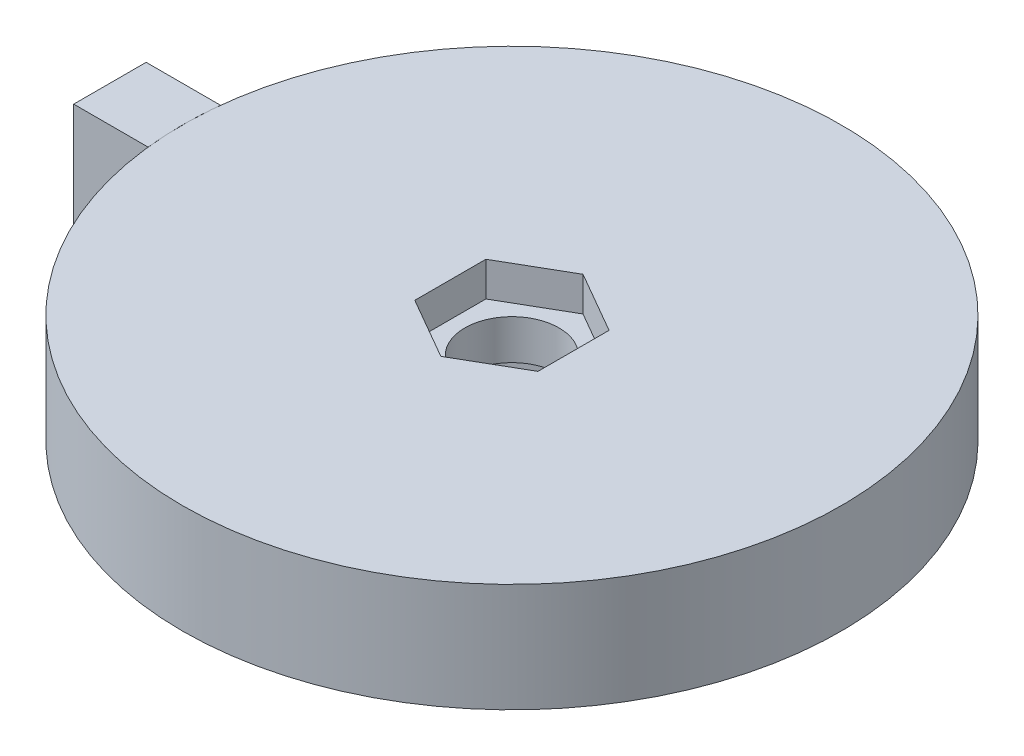
ISO-10303-21;
HEADER;
FILE_DESCRIPTION(('STEP AP214'),'2;1');
FILE_NAME('part.step','',(''),(''),'','','');
FILE_SCHEMA(('AUTOMOTIVE_DESIGN { 1 0 10303 214 1 1 1 1 }'));
ENDSEC;
DATA;
#1=APPLICATION_CONTEXT('core data for automotive mechanical design processes');
#2=APPLICATION_PROTOCOL_DEFINITION('international standard','automotive_design',2000,#1);
#3=PRODUCT_CONTEXT('',#1,'mechanical');
#4=PRODUCT('Part','Part','',(#3));
#5=PRODUCT_RELATED_PRODUCT_CATEGORY('part','',(#4));
#6=PRODUCT_DEFINITION_FORMATION('','',#4);
#7=PRODUCT_DEFINITION_CONTEXT('part definition',#1,'design');
#8=PRODUCT_DEFINITION('design','',#6,#7);
#9=PRODUCT_DEFINITION_SHAPE('','',#8);
#10=(LENGTH_UNIT() NAMED_UNIT(*) SI_UNIT(.MILLI.,.METRE.));
#11=(NAMED_UNIT(*) PLANE_ANGLE_UNIT() SI_UNIT($,.RADIAN.));
#12=(NAMED_UNIT(*) SI_UNIT($,.STERADIAN.) SOLID_ANGLE_UNIT());
#13=UNCERTAINTY_MEASURE_WITH_UNIT(LENGTH_MEASURE(1.E-05),#10,'distance_accuracy_value','');
#14=(GEOMETRIC_REPRESENTATION_CONTEXT(3) GLOBAL_UNCERTAINTY_ASSIGNED_CONTEXT((#13)) GLOBAL_UNIT_ASSIGNED_CONTEXT((#10,
#11,#12)) REPRESENTATION_CONTEXT('',''));
#15=CARTESIAN_POINT('',(0.,0.,0.));
#16=DIRECTION('',(0.,0.,1.));
#17=DIRECTION('',(1.,0.,0.));
#18=AXIS2_PLACEMENT_3D('',#15,#16,#17);
#19=CARTESIAN_POINT('',(-55.5,15.,0.));
#20=DIRECTION('',(-1.,0.,0.));
#21=DIRECTION('',(0.,0.,1.));
#22=AXIS2_PLACEMENT_3D('',#19,#20,#21);
#23=PLANE('',#22);
#24=DIRECTION('',(0.,0.,-1.));
#25=VECTOR('',#24,1.);
#26=CARTESIAN_POINT('',(-55.5,0.,0.));
#27=LINE('',#26,#25);
#28=CARTESIAN_POINT('',(-55.5,0.,5.));
#29=VERTEX_POINT('',#28);
#30=CARTESIAN_POINT('',(-55.5,0.,-5.));
#31=VERTEX_POINT('',#30);
#32=EDGE_CURVE('E112',#29,#31,#27,.T.);
#33=ORIENTED_EDGE('',*,*,#32,.F.);
#34=DIRECTION('',(0.,-1.,0.));
#35=VECTOR('',#34,1.);
#36=CARTESIAN_POINT('',(-55.5,15.,5.));
#37=LINE('',#36,#35);
#38=CARTESIAN_POINT('',(-55.5,15.,5.));
#39=VERTEX_POINT('',#38);
#40=EDGE_CURVE('E12',#39,#29,#37,.T.);
#41=ORIENTED_EDGE('',*,*,#40,.F.);
#42=DIRECTION('',(0.,0.,-1.));
#43=VECTOR('',#42,1.);
#44=CARTESIAN_POINT('',(-55.5,15.,0.));
#45=LINE('',#44,#43);
#46=CARTESIAN_POINT('',(-55.5,15.,-5.));
#47=VERTEX_POINT('',#46);
#48=EDGE_CURVE('E107',#39,#47,#45,.T.);
#49=ORIENTED_EDGE('',*,*,#48,.T.);
#50=DIRECTION('',(0.,-1.,0.));
#51=VECTOR('',#50,1.);
#52=CARTESIAN_POINT('',(-55.5,15.,-5.));
#53=LINE('',#52,#51);
#54=EDGE_CURVE('E50',#47,#31,#53,.T.);
#55=ORIENTED_EDGE('',*,*,#54,.T.);
#56=EDGE_LOOP('',(#33,#41,#49,#55));
#57=FACE_BOUND('',#56,.T.);
#58=ADVANCED_FACE('F47',(#57),#23,.T.);
#59=CARTESIAN_POINT('',(0.,15.,5.00000000000001));
#60=DIRECTION('',(0.,0.,-1.));
#61=DIRECTION('',(-1.,0.,0.));
#62=AXIS2_PLACEMENT_3D('',#59,#60,#61);
#63=PLANE('',#62);
#64=DIRECTION('',(1.,0.,0.));
#65=VECTOR('',#64,1.);
#66=CARTESIAN_POINT('',(0.,0.,5.00000000000001));
#67=LINE('',#66,#65);
#68=CARTESIAN_POINT('',(-45.224440295044,0.,5.));
#69=VERTEX_POINT('',#68);
#70=EDGE_CURVE('E80',#29,#69,#67,.T.);
#71=ORIENTED_EDGE('',*,*,#70,.T.);
#72=DIRECTION('',(0.,-1.,0.));
#73=VECTOR('',#72,1.);
#74=CARTESIAN_POINT('',(-45.224440295044,15.,5.));
#75=LINE('',#74,#73);
#76=CARTESIAN_POINT('',(-45.224440295044,15.,5.));
#77=VERTEX_POINT('',#76);
#78=EDGE_CURVE('E56',#77,#69,#75,.T.);
#79=ORIENTED_EDGE('',*,*,#78,.F.);
#80=DIRECTION('',(1.,0.,0.));
#81=VECTOR('',#80,1.);
#82=CARTESIAN_POINT('',(0.,15.,5.00000000000001));
#83=LINE('',#82,#81);
#84=EDGE_CURVE('E97',#39,#77,#83,.T.);
#85=ORIENTED_EDGE('',*,*,#84,.F.);
#86=ORIENTED_EDGE('',*,*,#40,.T.);
#87=EDGE_LOOP('',(#71,#79,#85,#86));
#88=FACE_BOUND('',#87,.T.);
#89=ADVANCED_FACE('F122',(#88),#63,.F.);
#90=CARTESIAN_POINT('',(0.,15.,0.));
#91=DIRECTION('',(0.,-1.,0.));
#92=DIRECTION('',(0.,0.,-1.));
#93=AXIS2_PLACEMENT_3D('',#90,#91,#92);
#94=CYLINDRICAL_SURFACE('',#93,45.5);
#95=CARTESIAN_POINT('',(0.,0.,0.));
#96=DIRECTION('',(0.,-1.,0.));
#97=DIRECTION('',(0.,0.,-1.));
#98=AXIS2_PLACEMENT_3D('',#95,#96,#97);
#99=CIRCLE('',#98,45.5);
#100=CARTESIAN_POINT('',(-45.224440295044,0.,-5.));
#101=VERTEX_POINT('',#100);
#102=EDGE_CURVE('E104',#69,#101,#99,.T.);
#103=ORIENTED_EDGE('',*,*,#102,.T.);
#104=DIRECTION('',(0.,-1.,0.));
#105=VECTOR('',#104,1.);
#106=CARTESIAN_POINT('',(-45.224440295044,15.,-5.));
#107=LINE('',#106,#105);
#108=CARTESIAN_POINT('',(-45.224440295044,15.,-5.));
#109=VERTEX_POINT('',#108);
#110=EDGE_CURVE('E101',#109,#101,#107,.T.);
#111=ORIENTED_EDGE('',*,*,#110,.F.);
#112=CARTESIAN_POINT('',(0.,15.,0.));
#113=DIRECTION('',(0.,-1.,0.));
#114=DIRECTION('',(0.,0.,-1.));
#115=AXIS2_PLACEMENT_3D('',#112,#113,#114);
#116=CIRCLE('',#115,45.5);
#117=EDGE_CURVE('E92',#77,#109,#116,.T.);
#118=ORIENTED_EDGE('',*,*,#117,.F.);
#119=ORIENTED_EDGE('',*,*,#78,.T.);
#120=EDGE_LOOP('',(#103,#111,#118,#119));
#121=FACE_BOUND('',#120,.T.);
#122=ADVANCED_FACE('F102',(#121),#94,.F.);
#123=CARTESIAN_POINT('',(0.,15.,-5.00000000000001));
#124=DIRECTION('',(0.,0.,-1.));
#125=DIRECTION('',(-1.,0.,0.));
#126=AXIS2_PLACEMENT_3D('',#123,#124,#125);
#127=PLANE('',#126);
#128=DIRECTION('',(1.,0.,0.));
#129=VECTOR('',#128,1.);
#130=CARTESIAN_POINT('',(0.,0.,-5.00000000000001));
#131=LINE('',#130,#129);
#132=EDGE_CURVE('E115',#31,#101,#131,.T.);
#133=ORIENTED_EDGE('',*,*,#132,.F.);
#134=ORIENTED_EDGE('',*,*,#54,.F.);
#135=DIRECTION('',(1.,0.,0.));
#136=VECTOR('',#135,1.);
#137=CARTESIAN_POINT('',(0.,15.,-5.00000000000001));
#138=LINE('',#137,#136);
#139=EDGE_CURVE('E96',#47,#109,#138,.T.);
#140=ORIENTED_EDGE('',*,*,#139,.T.);
#141=ORIENTED_EDGE('',*,*,#110,.T.);
#142=EDGE_LOOP('',(#133,#134,#140,#141));
#143=FACE_BOUND('',#142,.T.);
#144=ADVANCED_FACE('F106',(#143),#127,.T.);
#145=CARTESIAN_POINT('',(0.,15.,0.));
#146=DIRECTION('',(0.,-1.,0.));
#147=DIRECTION('',(0.,0.,-1.));
#148=AXIS2_PLACEMENT_3D('',#145,#146,#147);
#149=PLANE('',#148);
#150=ORIENTED_EDGE('',*,*,#48,.F.);
#151=ORIENTED_EDGE('',*,*,#84,.T.);
#152=ORIENTED_EDGE('',*,*,#117,.T.);
#153=ORIENTED_EDGE('',*,*,#139,.F.);
#154=EDGE_LOOP('',(#150,#151,#152,#153));
#155=FACE_BOUND('',#154,.T.);
#156=ADVANCED_FACE('F95',(#155),#149,.F.);
#157=CARTESIAN_POINT('',(0.,0.,0.));
#158=DIRECTION('',(0.,-1.,0.));
#159=DIRECTION('',(0.,0.,-1.));
#160=AXIS2_PLACEMENT_3D('',#157,#158,#159);
#161=PLANE('',#160);
#162=ORIENTED_EDGE('',*,*,#32,.T.);
#163=ORIENTED_EDGE('',*,*,#132,.T.);
#164=ORIENTED_EDGE('',*,*,#102,.F.);
#165=ORIENTED_EDGE('',*,*,#70,.F.);
#166=EDGE_LOOP('',(#162,#163,#164,#165));
#167=FACE_BOUND('',#166,.T.);
#168=ADVANCED_FACE('F120',(#167),#161,.T.);
#169=CLOSED_SHELL('',(#58,#89,#122,#144,#156,#168));
#170=MANIFOLD_SOLID_BREP('B2',#169);
#171=CARTESIAN_POINT('',(0.,0.,0.));
#172=DIRECTION('',(0.,1.,0.));
#173=DIRECTION('',(0.,0.,1.));
#174=AXIS2_PLACEMENT_3D('',#171,#172,#173);
#175=PLANE('',#174);
#176=CARTESIAN_POINT('',(0.,0.,0.));
#177=DIRECTION('',(0.,1.,0.));
#178=DIRECTION('',(0.,0.,1.));
#179=AXIS2_PLACEMENT_3D('',#176,#177,#178);
#180=CIRCLE('',#179,45.5);
#181=CARTESIAN_POINT('',(0.,0.,45.5));
#182=VERTEX_POINT('',#181);
#183=EDGE_CURVE('E189',#182,#182,#180,.T.);
#184=ORIENTED_EDGE('',*,*,#183,.F.);
#185=EDGE_LOOP('',(#184));
#186=FACE_BOUND('',#185,.T.);
#187=DIRECTION('',(-0.866025403784439,0.,0.5));
#188=VECTOR('',#187,1.);
#189=CARTESIAN_POINT('',(0.,0.,-9.81495457622362));
#190=LINE('',#189,#188);
#191=CARTESIAN_POINT('',(0.,0.,-9.81495457622362));
#192=VERTEX_POINT('',#191);
#193=CARTESIAN_POINT('',(-8.5,0.,-4.90747728811182));
#194=VERTEX_POINT('',#193);
#195=EDGE_CURVE('E197',#192,#194,#190,.T.);
#196=ORIENTED_EDGE('',*,*,#195,.T.);
#197=DIRECTION('',(0.,0.,1.));
#198=VECTOR('',#197,1.);
#199=CARTESIAN_POINT('',(-8.5,0.,-4.90747728811182));
#200=LINE('',#199,#198);
#201=CARTESIAN_POINT('',(-8.5,0.,4.90747728811182));
#202=VERTEX_POINT('',#201);
#203=EDGE_CURVE('E293',#194,#202,#200,.T.);
#204=ORIENTED_EDGE('',*,*,#203,.T.);
#205=DIRECTION('',(0.866025403784438,0.,0.5));
#206=VECTOR('',#205,1.);
#207=CARTESIAN_POINT('',(-8.5,0.,4.90747728811182));
#208=LINE('',#207,#206);
#209=CARTESIAN_POINT('',(0.,0.,9.81495457622364));
#210=VERTEX_POINT('',#209);
#211=EDGE_CURVE('E384',#202,#210,#208,.T.);
#212=ORIENTED_EDGE('',*,*,#211,.T.);
#213=DIRECTION('',(0.866025403784438,0.,-0.5));
#214=VECTOR('',#213,1.);
#215=CARTESIAN_POINT('',(0.,0.,9.81495457622364));
#216=LINE('',#215,#214);
#217=CARTESIAN_POINT('',(8.5,0.,4.90747728811182));
#218=VERTEX_POINT('',#217);
#219=EDGE_CURVE('E391',#210,#218,#216,.T.);
#220=ORIENTED_EDGE('',*,*,#219,.T.);
#221=DIRECTION('',(0.,0.,-1.));
#222=VECTOR('',#221,1.);
#223=CARTESIAN_POINT('',(8.5,0.,4.90747728811182));
#224=LINE('',#223,#222);
#225=CARTESIAN_POINT('',(8.5,0.,-4.90747728811179));
#226=VERTEX_POINT('',#225);
#227=EDGE_CURVE('E394',#218,#226,#224,.T.);
#228=ORIENTED_EDGE('',*,*,#227,.T.);
#229=DIRECTION('',(-0.866025403784439,0.,-0.5));
#230=VECTOR('',#229,1.);
#231=CARTESIAN_POINT('',(8.5,0.,-4.90747728811179));
#232=LINE('',#231,#230);
#233=EDGE_CURVE('E289',#226,#192,#232,.T.);
#234=ORIENTED_EDGE('',*,*,#233,.T.);
#235=EDGE_LOOP('',(#196,#204,#212,#220,#228,#234));
#236=FACE_BOUND('',#235,.T.);
#237=ADVANCED_FACE('F180',(#186,#236),#175,.F.);
#238=CARTESIAN_POINT('',(0.,0.,0.));
#239=DIRECTION('',(0.,1.,0.));
#240=DIRECTION('',(0.,0.,1.));
#241=AXIS2_PLACEMENT_3D('',#238,#239,#240);
#242=CYLINDRICAL_SURFACE('',#241,6.5);
#243=CARTESIAN_POINT('',(0.,4.75,0.));
#244=DIRECTION('',(0.,1.,0.));
#245=DIRECTION('',(0.,0.,1.));
#246=AXIS2_PLACEMENT_3D('',#243,#244,#245);
#247=CIRCLE('',#246,6.5);
#248=CARTESIAN_POINT('',(0.,4.75,6.5));
#249=VERTEX_POINT('',#248);
#250=EDGE_CURVE('E184',#249,#249,#247,.F.);
#251=ORIENTED_EDGE('',*,*,#250,.T.);
#252=EDGE_LOOP('',(#251));
#253=FACE_BOUND('',#252,.T.);
#254=CARTESIAN_POINT('',(0.,10.25,0.));
#255=DIRECTION('',(0.,1.,0.));
#256=DIRECTION('',(0.,0.,1.));
#257=AXIS2_PLACEMENT_3D('',#254,#255,#256);
#258=CIRCLE('',#257,6.5);
#259=CARTESIAN_POINT('',(0.,10.25,6.5));
#260=VERTEX_POINT('',#259);
#261=EDGE_CURVE('E332',#260,#260,#258,.F.);
#262=ORIENTED_EDGE('',*,*,#261,.F.);
#263=EDGE_LOOP('',(#262));
#264=FACE_BOUND('',#263,.T.);
#265=ADVANCED_FACE('F348',(#253,#264),#242,.F.);
#266=CARTESIAN_POINT('',(0.,15.,0.));
#267=DIRECTION('',(0.,-1.,0.));
#268=DIRECTION('',(0.,0.,-1.));
#269=AXIS2_PLACEMENT_3D('',#266,#267,#268);
#270=CYLINDRICAL_SURFACE('',#269,45.5);
#271=CARTESIAN_POINT('',(0.,15.,0.));
#272=DIRECTION('',(0.,1.,0.));
#273=DIRECTION('',(0.,0.,1.));
#274=AXIS2_PLACEMENT_3D('',#271,#272,#273);
#275=CIRCLE('',#274,45.5);
#276=CARTESIAN_POINT('',(0.,15.,45.5));
#277=VERTEX_POINT('',#276);
#278=EDGE_CURVE('E45',#277,#277,#275,.T.);
#279=ORIENTED_EDGE('',*,*,#278,.F.);
#280=EDGE_LOOP('',(#279));
#281=FACE_BOUND('',#280,.T.);
#282=ORIENTED_EDGE('',*,*,#183,.T.);
#283=EDGE_LOOP('',(#282));
#284=FACE_BOUND('',#283,.T.);
#285=ADVANCED_FACE('F182',(#281,#284),#270,.T.);
#286=CARTESIAN_POINT('',(0.,15.,0.));
#287=DIRECTION('',(0.,1.,0.));
#288=DIRECTION('',(0.,0.,1.));
#289=AXIS2_PLACEMENT_3D('',#286,#287,#288);
#290=PLANE('',#289);
#291=DIRECTION('',(0.,0.,-1.));
#292=VECTOR('',#291,1.);
#293=CARTESIAN_POINT('',(8.5,15.,4.90747728811182));
#294=LINE('',#293,#292);
#295=CARTESIAN_POINT('',(8.5,15.,4.90747728811182));
#296=VERTEX_POINT('',#295);
#297=CARTESIAN_POINT('',(8.5,15.,-4.90747728811179));
#298=VERTEX_POINT('',#297);
#299=EDGE_CURVE('E306',#296,#298,#294,.T.);
#300=ORIENTED_EDGE('',*,*,#299,.F.);
#301=DIRECTION('',(0.866025403784438,0.,-0.500000000000001));
#302=VECTOR('',#301,1.);
#303=CARTESIAN_POINT('',(4.25000000000001,15.,7.36121593216773));
#304=LINE('',#303,#302);
#305=CARTESIAN_POINT('',(0.,15.,9.81495457622364));
#306=VERTEX_POINT('',#305);
#307=EDGE_CURVE('E326',#306,#296,#304,.T.);
#308=ORIENTED_EDGE('',*,*,#307,.F.);
#309=DIRECTION('',(0.866025403784439,0.,0.5));
#310=VECTOR('',#309,1.);
#311=CARTESIAN_POINT('',(-4.25,15.,7.36121593216773));
#312=LINE('',#311,#310);
#313=CARTESIAN_POINT('',(-8.5,15.,4.90747728811182));
#314=VERTEX_POINT('',#313);
#315=EDGE_CURVE('E323',#314,#306,#312,.T.);
#316=ORIENTED_EDGE('',*,*,#315,.F.);
#317=DIRECTION('',(0.,0.,1.));
#318=VECTOR('',#317,1.);
#319=CARTESIAN_POINT('',(-8.5,15.,0.));
#320=LINE('',#319,#318);
#321=CARTESIAN_POINT('',(-8.5,15.,-4.90747728811182));
#322=VERTEX_POINT('',#321);
#323=EDGE_CURVE('E320',#322,#314,#320,.T.);
#324=ORIENTED_EDGE('',*,*,#323,.F.);
#325=DIRECTION('',(-0.866025403784439,0.,0.499999999999999));
#326=VECTOR('',#325,1.);
#327=CARTESIAN_POINT('',(-4.25,15.,-7.36121593216772));
#328=LINE('',#327,#326);
#329=CARTESIAN_POINT('',(0.,15.,-9.81495457622362));
#330=VERTEX_POINT('',#329);
#331=EDGE_CURVE('E317',#330,#322,#328,.T.);
#332=ORIENTED_EDGE('',*,*,#331,.F.);
#333=DIRECTION('',(-0.866025403784439,0.,-0.5));
#334=VECTOR('',#333,1.);
#335=CARTESIAN_POINT('',(4.25000000000002,15.,-7.36121593216769));
#336=LINE('',#335,#334);
#337=EDGE_CURVE('E297',#298,#330,#336,.T.);
#338=ORIENTED_EDGE('',*,*,#337,.F.);
#339=EDGE_LOOP('',(#300,#308,#316,#324,#332,#338));
#340=FACE_BOUND('',#339,.T.);
#341=ORIENTED_EDGE('',*,*,#278,.T.);
#342=EDGE_LOOP('',(#341));
#343=FACE_BOUND('',#342,.T.);
#344=ADVANCED_FACE('F356',(#340,#343),#290,.T.);
#345=CARTESIAN_POINT('',(0.,10.25,0.));
#346=DIRECTION('',(0.,1.,0.));
#347=DIRECTION('',(0.,0.,1.));
#348=AXIS2_PLACEMENT_3D('',#345,#346,#347);
#349=PLANE('',#348);
#350=DIRECTION('',(0.,0.,-1.));
#351=VECTOR('',#350,1.);
#352=CARTESIAN_POINT('',(8.5,10.25,0.));
#353=LINE('',#352,#351);
#354=CARTESIAN_POINT('',(8.5,10.25,4.90747728811182));
#355=VERTEX_POINT('',#354);
#356=CARTESIAN_POINT('',(8.5,10.25,-4.90747728811183));
#357=VERTEX_POINT('',#356);
#358=EDGE_CURVE('E302',#355,#357,#353,.T.);
#359=ORIENTED_EDGE('',*,*,#358,.T.);
#360=DIRECTION('',(-0.866025403784442,0.,-0.499999999999994));
#361=VECTOR('',#360,1.);
#362=CARTESIAN_POINT('',(8.5,10.25,-4.90747728811183));
#363=LINE('',#362,#361);
#364=CARTESIAN_POINT('',(0.,10.25,-9.81495457622362));
#365=VERTEX_POINT('',#364);
#366=EDGE_CURVE('E305',#357,#365,#363,.T.);
#367=ORIENTED_EDGE('',*,*,#366,.T.);
#368=DIRECTION('',(-0.866025403784439,0.,0.5));
#369=VECTOR('',#368,1.);
#370=CARTESIAN_POINT('',(0.,10.25,-9.81495457622362));
#371=LINE('',#370,#369);
#372=CARTESIAN_POINT('',(-8.5,10.25,-4.90747728811182));
#373=VERTEX_POINT('',#372);
#374=EDGE_CURVE('E308',#365,#373,#371,.T.);
#375=ORIENTED_EDGE('',*,*,#374,.T.);
#376=DIRECTION('',(0.,0.,1.));
#377=VECTOR('',#376,1.);
#378=CARTESIAN_POINT('',(-8.5,10.25,-4.90747728811182));
#379=LINE('',#378,#377);
#380=CARTESIAN_POINT('',(-8.5,10.25,4.90747728811182));
#381=VERTEX_POINT('',#380);
#382=EDGE_CURVE('E310',#373,#381,#379,.T.);
#383=ORIENTED_EDGE('',*,*,#382,.T.);
#384=DIRECTION('',(0.866025403784439,0.,0.5));
#385=VECTOR('',#384,1.);
#386=CARTESIAN_POINT('',(-8.5,10.25,4.90747728811182));
#387=LINE('',#386,#385);
#388=CARTESIAN_POINT('',(0.,10.25,9.81495457622364));
#389=VERTEX_POINT('',#388);
#390=EDGE_CURVE('E312',#381,#389,#387,.T.);
#391=ORIENTED_EDGE('',*,*,#390,.T.);
#392=DIRECTION('',(0.866025403784439,0.,-0.5));
#393=VECTOR('',#392,1.);
#394=CARTESIAN_POINT('',(0.,10.25,9.81495457622364));
#395=LINE('',#394,#393);
#396=EDGE_CURVE('E314',#389,#355,#395,.T.);
#397=ORIENTED_EDGE('',*,*,#396,.T.);
#398=EDGE_LOOP('',(#359,#367,#375,#383,#391,#397));
#399=FACE_BOUND('',#398,.T.);
#400=ORIENTED_EDGE('',*,*,#261,.T.);
#401=EDGE_LOOP('',(#400));
#402=FACE_BOUND('',#401,.T.);
#403=ADVANCED_FACE('F346',(#399,#402),#349,.T.);
#404=CARTESIAN_POINT('',(8.5,10.25,4.90747728811182));
#405=DIRECTION('',(1.,0.,0.));
#406=DIRECTION('',(0.,0.,-1.));
#407=AXIS2_PLACEMENT_3D('',#404,#405,#406);
#408=PLANE('',#407);
#409=ORIENTED_EDGE('',*,*,#299,.T.);
#410=DIRECTION('',(0.,1.,0.));
#411=VECTOR('',#410,1.);
#412=CARTESIAN_POINT('',(8.5,10.25,-4.90747728811183));
#413=LINE('',#412,#411);
#414=EDGE_CURVE('E205',#357,#298,#413,.T.);
#415=ORIENTED_EDGE('',*,*,#414,.F.);
#416=ORIENTED_EDGE('',*,*,#358,.F.);
#417=DIRECTION('',(0.,1.,0.));
#418=VECTOR('',#417,1.);
#419=CARTESIAN_POINT('',(8.5,10.25,4.90747728811182));
#420=LINE('',#419,#418);
#421=EDGE_CURVE('E330',#355,#296,#420,.T.);
#422=ORIENTED_EDGE('',*,*,#421,.T.);
#423=EDGE_LOOP('',(#409,#415,#416,#422));
#424=FACE_BOUND('',#423,.T.);
#425=ADVANCED_FACE('F368',(#424),#408,.F.);
#426=CARTESIAN_POINT('',(4.25000000000001,10.25,7.36121593216773));
#427=DIRECTION('',(0.500000000000001,0.,0.866025403784438));
#428=DIRECTION('',(0.866025403784438,0.,-0.500000000000001));
#429=AXIS2_PLACEMENT_3D('',#426,#427,#428);
#430=PLANE('',#429);
#431=ORIENTED_EDGE('',*,*,#307,.T.);
#432=ORIENTED_EDGE('',*,*,#421,.F.);
#433=ORIENTED_EDGE('',*,*,#396,.F.);
#434=DIRECTION('',(0.,1.,0.));
#435=VECTOR('',#434,1.);
#436=CARTESIAN_POINT('',(0.,10.25,9.81495457622364));
#437=LINE('',#436,#435);
#438=EDGE_CURVE('E333',#389,#306,#437,.T.);
#439=ORIENTED_EDGE('',*,*,#438,.T.);
#440=EDGE_LOOP('',(#431,#432,#433,#439));
#441=FACE_BOUND('',#440,.T.);
#442=ADVANCED_FACE('F438',(#441),#430,.F.);
#443=CARTESIAN_POINT('',(-4.25,10.25,7.36121593216773));
#444=DIRECTION('',(-0.5,0.,0.866025403784439));
#445=DIRECTION('',(0.866025403784439,0.,0.5));
#446=AXIS2_PLACEMENT_3D('',#443,#444,#445);
#447=PLANE('',#446);
#448=ORIENTED_EDGE('',*,*,#315,.T.);
#449=ORIENTED_EDGE('',*,*,#438,.F.);
#450=ORIENTED_EDGE('',*,*,#390,.F.);
#451=DIRECTION('',(0.,1.,0.));
#452=VECTOR('',#451,1.);
#453=CARTESIAN_POINT('',(-8.5,10.25,4.90747728811182));
#454=LINE('',#453,#452);
#455=EDGE_CURVE('E335',#381,#314,#454,.T.);
#456=ORIENTED_EDGE('',*,*,#455,.T.);
#457=EDGE_LOOP('',(#448,#449,#450,#456));
#458=FACE_BOUND('',#457,.T.);
#459=ADVANCED_FACE('F442',(#458),#447,.F.);
#460=CARTESIAN_POINT('',(-8.5,10.25,0.));
#461=DIRECTION('',(-1.,0.,0.));
#462=DIRECTION('',(0.,0.,1.));
#463=AXIS2_PLACEMENT_3D('',#460,#461,#462);
#464=PLANE('',#463);
#465=ORIENTED_EDGE('',*,*,#323,.T.);
#466=ORIENTED_EDGE('',*,*,#455,.F.);
#467=ORIENTED_EDGE('',*,*,#382,.F.);
#468=DIRECTION('',(0.,1.,0.));
#469=VECTOR('',#468,1.);
#470=CARTESIAN_POINT('',(-8.5,10.25,-4.90747728811182));
#471=LINE('',#470,#469);
#472=EDGE_CURVE('E337',#373,#322,#471,.T.);
#473=ORIENTED_EDGE('',*,*,#472,.T.);
#474=EDGE_LOOP('',(#465,#466,#467,#473));
#475=FACE_BOUND('',#474,.T.);
#476=ADVANCED_FACE('F446',(#475),#464,.F.);
#477=CARTESIAN_POINT('',(-4.25,10.25,-7.36121593216772));
#478=DIRECTION('',(-0.499999999999999,0.,-0.866025403784439));
#479=DIRECTION('',(-0.866025403784439,0.,0.499999999999999));
#480=AXIS2_PLACEMENT_3D('',#477,#478,#479);
#481=PLANE('',#480);
#482=ORIENTED_EDGE('',*,*,#331,.T.);
#483=ORIENTED_EDGE('',*,*,#472,.F.);
#484=ORIENTED_EDGE('',*,*,#374,.F.);
#485=DIRECTION('',(0.,1.,0.));
#486=VECTOR('',#485,1.);
#487=CARTESIAN_POINT('',(0.,10.25,-9.81495457622362));
#488=LINE('',#487,#486);
#489=EDGE_CURVE('E339',#365,#330,#488,.T.);
#490=ORIENTED_EDGE('',*,*,#489,.T.);
#491=EDGE_LOOP('',(#482,#483,#484,#490));
#492=FACE_BOUND('',#491,.T.);
#493=ADVANCED_FACE('F449',(#492),#481,.F.);
#494=CARTESIAN_POINT('',(4.25000000000002,10.25,-7.36121593216769));
#495=DIRECTION('',(0.5,0.,-0.866025403784439));
#496=DIRECTION('',(-0.866025403784439,0.,-0.5));
#497=AXIS2_PLACEMENT_3D('',#494,#495,#496);
#498=PLANE('',#497);
#499=ORIENTED_EDGE('',*,*,#337,.T.);
#500=ORIENTED_EDGE('',*,*,#489,.F.);
#501=ORIENTED_EDGE('',*,*,#366,.F.);
#502=ORIENTED_EDGE('',*,*,#414,.T.);
#503=EDGE_LOOP('',(#499,#500,#501,#502));
#504=FACE_BOUND('',#503,.T.);
#505=ADVANCED_FACE('F361',(#504),#498,.F.);
#506=CARTESIAN_POINT('',(0.,4.75,0.));
#507=DIRECTION('',(0.,1.,0.));
#508=DIRECTION('',(0.,0.,1.));
#509=AXIS2_PLACEMENT_3D('',#506,#507,#508);
#510=PLANE('',#509);
#511=DIRECTION('',(-0.866025403784439,0.,0.5));
#512=VECTOR('',#511,1.);
#513=CARTESIAN_POINT('',(0.,4.75,-9.81495457622362));
#514=LINE('',#513,#512);
#515=CARTESIAN_POINT('',(0.,4.75,-9.81495457622362));
#516=VERTEX_POINT('',#515);
#517=CARTESIAN_POINT('',(-8.5,4.75,-4.90747728811182));
#518=VERTEX_POINT('',#517);
#519=EDGE_CURVE('E279',#516,#518,#514,.T.);
#520=ORIENTED_EDGE('',*,*,#519,.F.);
#521=DIRECTION('',(-0.866025403784439,0.,-0.5));
#522=VECTOR('',#521,1.);
#523=CARTESIAN_POINT('',(8.5,4.75,-4.90747728811179));
#524=LINE('',#523,#522);
#525=CARTESIAN_POINT('',(8.5,4.75,-4.90747728811179));
#526=VERTEX_POINT('',#525);
#527=EDGE_CURVE('E387',#526,#516,#524,.T.);
#528=ORIENTED_EDGE('',*,*,#527,.F.);
#529=DIRECTION('',(0.,0.,-1.));
#530=VECTOR('',#529,1.);
#531=CARTESIAN_POINT('',(8.5,4.75,4.90747728811182));
#532=LINE('',#531,#530);
#533=CARTESIAN_POINT('',(8.5,4.75,4.90747728811182));
#534=VERTEX_POINT('',#533);
#535=EDGE_CURVE('E414',#534,#526,#532,.T.);
#536=ORIENTED_EDGE('',*,*,#535,.F.);
#537=DIRECTION('',(0.866025403784438,0.,-0.5));
#538=VECTOR('',#537,1.);
#539=CARTESIAN_POINT('',(0.,4.75,9.81495457622364));
#540=LINE('',#539,#538);
#541=CARTESIAN_POINT('',(0.,4.75,9.81495457622364));
#542=VERTEX_POINT('',#541);
#543=EDGE_CURVE('E417',#542,#534,#540,.T.);
#544=ORIENTED_EDGE('',*,*,#543,.F.);
#545=DIRECTION('',(0.866025403784438,0.,0.5));
#546=VECTOR('',#545,1.);
#547=CARTESIAN_POINT('',(-8.5,4.75,4.90747728811182));
#548=LINE('',#547,#546);
#549=CARTESIAN_POINT('',(-8.5,4.75,4.90747728811182));
#550=VERTEX_POINT('',#549);
#551=EDGE_CURVE('E281',#550,#542,#548,.T.);
#552=ORIENTED_EDGE('',*,*,#551,.F.);
#553=DIRECTION('',(0.,0.,1.));
#554=VECTOR('',#553,1.);
#555=CARTESIAN_POINT('',(-8.5,4.75,-4.90747728811182));
#556=LINE('',#555,#554);
#557=EDGE_CURVE('E274',#518,#550,#556,.T.);
#558=ORIENTED_EDGE('',*,*,#557,.F.);
#559=EDGE_LOOP('',(#520,#528,#536,#544,#552,#558));
#560=FACE_BOUND('',#559,.T.);
#561=ORIENTED_EDGE('',*,*,#250,.F.);
#562=EDGE_LOOP('',(#561));
#563=FACE_BOUND('',#562,.T.);
#564=ADVANCED_FACE('F276',(#560,#563),#510,.F.);
#565=CARTESIAN_POINT('',(0.,4.75,-9.81495457622362));
#566=DIRECTION('',(0.5,0.,0.866025403784439));
#567=DIRECTION('',(0.866025403784439,0.,-0.5));
#568=AXIS2_PLACEMENT_3D('',#565,#566,#567);
#569=PLANE('',#568);
#570=ORIENTED_EDGE('',*,*,#195,.F.);
#571=DIRECTION('',(0.,-1.,0.));
#572=VECTOR('',#571,1.);
#573=CARTESIAN_POINT('',(0.,4.75,-9.81495457622362));
#574=LINE('',#573,#572);
#575=EDGE_CURVE('E288',#516,#192,#574,.T.);
#576=ORIENTED_EDGE('',*,*,#575,.F.);
#577=ORIENTED_EDGE('',*,*,#519,.T.);
#578=DIRECTION('',(0.,-1.,0.));
#579=VECTOR('',#578,1.);
#580=CARTESIAN_POINT('',(-8.5,4.75,-4.90747728811182));
#581=LINE('',#580,#579);
#582=EDGE_CURVE('E287',#518,#194,#581,.T.);
#583=ORIENTED_EDGE('',*,*,#582,.T.);
#584=EDGE_LOOP('',(#570,#576,#577,#583));
#585=FACE_BOUND('',#584,.T.);
#586=ADVANCED_FACE('F286',(#585),#569,.T.);
#587=CARTESIAN_POINT('',(-8.5,4.75,-4.90747728811182));
#588=DIRECTION('',(1.,0.,0.));
#589=DIRECTION('',(0.,0.,-1.));
#590=AXIS2_PLACEMENT_3D('',#587,#588,#589);
#591=PLANE('',#590);
#592=ORIENTED_EDGE('',*,*,#203,.F.);
#593=ORIENTED_EDGE('',*,*,#582,.F.);
#594=ORIENTED_EDGE('',*,*,#557,.T.);
#595=DIRECTION('',(0.,-1.,0.));
#596=VECTOR('',#595,1.);
#597=CARTESIAN_POINT('',(-8.5,4.75,4.90747728811182));
#598=LINE('',#597,#596);
#599=EDGE_CURVE('E294',#550,#202,#598,.T.);
#600=ORIENTED_EDGE('',*,*,#599,.T.);
#601=EDGE_LOOP('',(#592,#593,#594,#600));
#602=FACE_BOUND('',#601,.T.);
#603=ADVANCED_FACE('F291',(#602),#591,.T.);
#604=CARTESIAN_POINT('',(-8.5,4.75,4.90747728811182));
#605=DIRECTION('',(0.5,0.,-0.866025403784439));
#606=DIRECTION('',(-0.866025403784439,0.,-0.5));
#607=AXIS2_PLACEMENT_3D('',#604,#605,#606);
#608=PLANE('',#607);
#609=ORIENTED_EDGE('',*,*,#211,.F.);
#610=ORIENTED_EDGE('',*,*,#599,.F.);
#611=ORIENTED_EDGE('',*,*,#551,.T.);
#612=DIRECTION('',(0.,-1.,0.));
#613=VECTOR('',#612,1.);
#614=CARTESIAN_POINT('',(0.,4.75,9.81495457622364));
#615=LINE('',#614,#613);
#616=EDGE_CURVE('E298',#542,#210,#615,.T.);
#617=ORIENTED_EDGE('',*,*,#616,.T.);
#618=EDGE_LOOP('',(#609,#610,#611,#617));
#619=FACE_BOUND('',#618,.T.);
#620=ADVANCED_FACE('F405',(#619),#608,.T.);
#621=CARTESIAN_POINT('',(0.,4.75,9.81495457622364));
#622=DIRECTION('',(-0.5,0.,-0.866025403784438));
#623=DIRECTION('',(-0.866025403784439,0.,0.5));
#624=AXIS2_PLACEMENT_3D('',#621,#622,#623);
#625=PLANE('',#624);
#626=ORIENTED_EDGE('',*,*,#219,.F.);
#627=ORIENTED_EDGE('',*,*,#616,.F.);
#628=ORIENTED_EDGE('',*,*,#543,.T.);
#629=DIRECTION('',(0.,-1.,0.));
#630=VECTOR('',#629,1.);
#631=CARTESIAN_POINT('',(8.5,4.75,4.90747728811182));
#632=LINE('',#631,#630);
#633=EDGE_CURVE('E400',#534,#218,#632,.T.);
#634=ORIENTED_EDGE('',*,*,#633,.T.);
#635=EDGE_LOOP('',(#626,#627,#628,#634));
#636=FACE_BOUND('',#635,.T.);
#637=ADVANCED_FACE('F407',(#636),#625,.T.);
#638=CARTESIAN_POINT('',(8.5,4.75,4.90747728811182));
#639=DIRECTION('',(-1.,0.,0.));
#640=DIRECTION('',(0.,0.,1.));
#641=AXIS2_PLACEMENT_3D('',#638,#639,#640);
#642=PLANE('',#641);
#643=ORIENTED_EDGE('',*,*,#227,.F.);
#644=ORIENTED_EDGE('',*,*,#633,.F.);
#645=ORIENTED_EDGE('',*,*,#535,.T.);
#646=DIRECTION('',(0.,-1.,0.));
#647=VECTOR('',#646,1.);
#648=CARTESIAN_POINT('',(8.5,4.75,-4.90747728811179));
#649=LINE('',#648,#647);
#650=EDGE_CURVE('E398',#526,#226,#649,.T.);
#651=ORIENTED_EDGE('',*,*,#650,.T.);
#652=EDGE_LOOP('',(#643,#644,#645,#651));
#653=FACE_BOUND('',#652,.T.);
#654=ADVANCED_FACE('F411',(#653),#642,.T.);
#655=CARTESIAN_POINT('',(8.5,4.75,-4.90747728811179));
#656=DIRECTION('',(-0.5,0.,0.866025403784439));
#657=DIRECTION('',(0.866025403784439,0.,0.5));
#658=AXIS2_PLACEMENT_3D('',#655,#656,#657);
#659=PLANE('',#658);
#660=ORIENTED_EDGE('',*,*,#233,.F.);
#661=ORIENTED_EDGE('',*,*,#650,.F.);
#662=ORIENTED_EDGE('',*,*,#527,.T.);
#663=ORIENTED_EDGE('',*,*,#575,.T.);
#664=EDGE_LOOP('',(#660,#661,#662,#663));
#665=FACE_BOUND('',#664,.T.);
#666=ADVANCED_FACE('F416',(#665),#659,.T.);
#667=CLOSED_SHELL('',(#237,#265,#285,#344,#403,#425,#442,#459,#476,#493,#505,#564,#586,#603,
#620,#637,#654,#666));
#668=MANIFOLD_SOLID_BREP('B6',#667);
#669=ADVANCED_BREP_SHAPE_REPRESENTATION('',(#18,#170,#668),#14);
#670=SHAPE_DEFINITION_REPRESENTATION(#9,#669);
ENDSEC;
END-ISO-10303-21;
